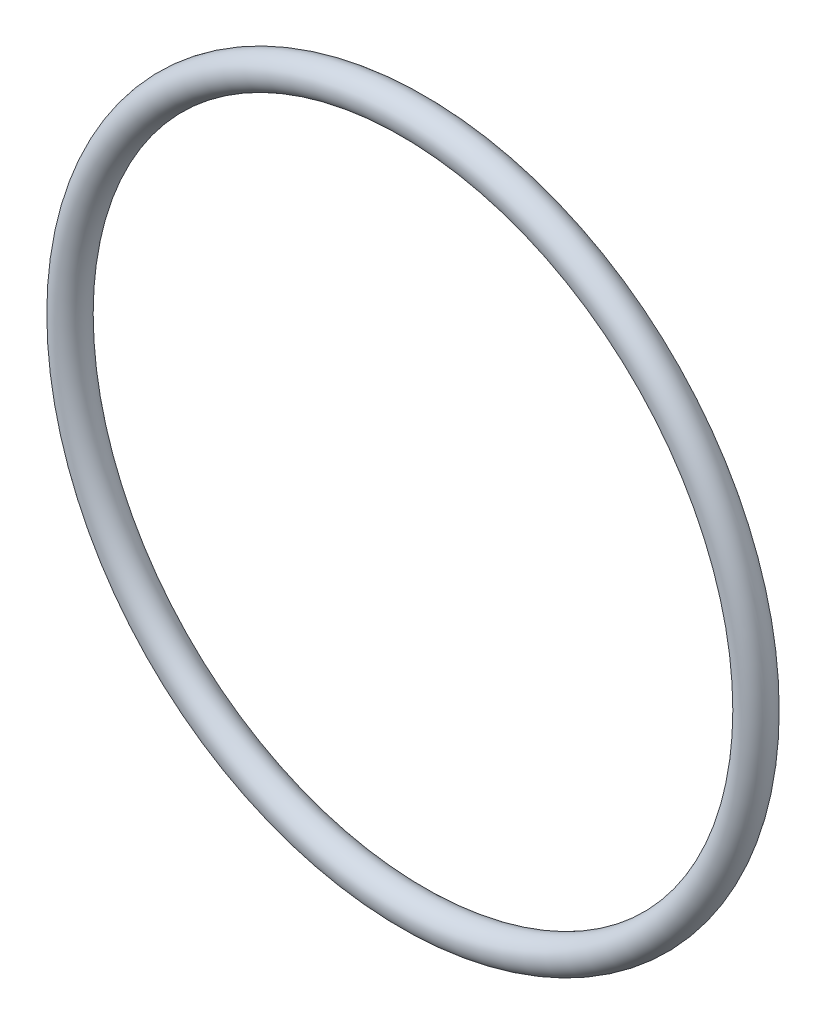
ISO-10303-21;
HEADER;
FILE_DESCRIPTION(('STEP AP214'),'2;1');
FILE_NAME('part.step','',(''),(''),'','','');
FILE_SCHEMA(('AUTOMOTIVE_DESIGN { 1 0 10303 214 1 1 1 1 }'));
ENDSEC;
DATA;
#1=APPLICATION_CONTEXT('core data for automotive mechanical design processes');
#2=APPLICATION_PROTOCOL_DEFINITION('international standard','automotive_design',2000,#1);
#3=PRODUCT_CONTEXT('',#1,'mechanical');
#4=PRODUCT('Part','Part','',(#3));
#5=PRODUCT_RELATED_PRODUCT_CATEGORY('part','',(#4));
#6=PRODUCT_DEFINITION_FORMATION('','',#4);
#7=PRODUCT_DEFINITION_CONTEXT('part definition',#1,'design');
#8=PRODUCT_DEFINITION('design','',#6,#7);
#9=PRODUCT_DEFINITION_SHAPE('','',#8);
#10=(LENGTH_UNIT() NAMED_UNIT(*) SI_UNIT(.MILLI.,.METRE.));
#11=(NAMED_UNIT(*) PLANE_ANGLE_UNIT() SI_UNIT($,.RADIAN.));
#12=(NAMED_UNIT(*) SI_UNIT($,.STERADIAN.) SOLID_ANGLE_UNIT());
#13=UNCERTAINTY_MEASURE_WITH_UNIT(LENGTH_MEASURE(1.E-05),#10,'distance_accuracy_value','');
#14=(GEOMETRIC_REPRESENTATION_CONTEXT(3) GLOBAL_UNCERTAINTY_ASSIGNED_CONTEXT((#13)) GLOBAL_UNIT_ASSIGNED_CONTEXT((#10,
#11,#12)) REPRESENTATION_CONTEXT('',''));
#15=CARTESIAN_POINT('',(0.,0.,0.));
#16=DIRECTION('',(0.,0.,1.));
#17=DIRECTION('',(1.,0.,0.));
#18=AXIS2_PLACEMENT_3D('',#15,#16,#17);
#19=CARTESIAN_POINT('',(0.,0.,0.));
#20=DIRECTION('',(0.,0.,1.));
#21=DIRECTION('',(1.,0.,0.));
#22=AXIS2_PLACEMENT_3D('',#19,#20,#21);
#23=TOROIDAL_SURFACE('',#22,27.3431,1.3081);
#24=CARTESIAN_POINT('',(28.6512,0.,0.));
#25=VERTEX_POINT('',#24);
#26=VERTEX_LOOP('',#25);
#27=FACE_BOUND('',#26,.T.);
#28=ADVANCED_FACE('F37',(#27),#23,.T.);
#29=CLOSED_SHELL('',(#28));
#30=MANIFOLD_SOLID_BREP('B2',#29);
#31=ADVANCED_BREP_SHAPE_REPRESENTATION('',(#18,#30),#14);
#32=SHAPE_DEFINITION_REPRESENTATION(#9,#31);
ENDSEC;
END-ISO-10303-21;
